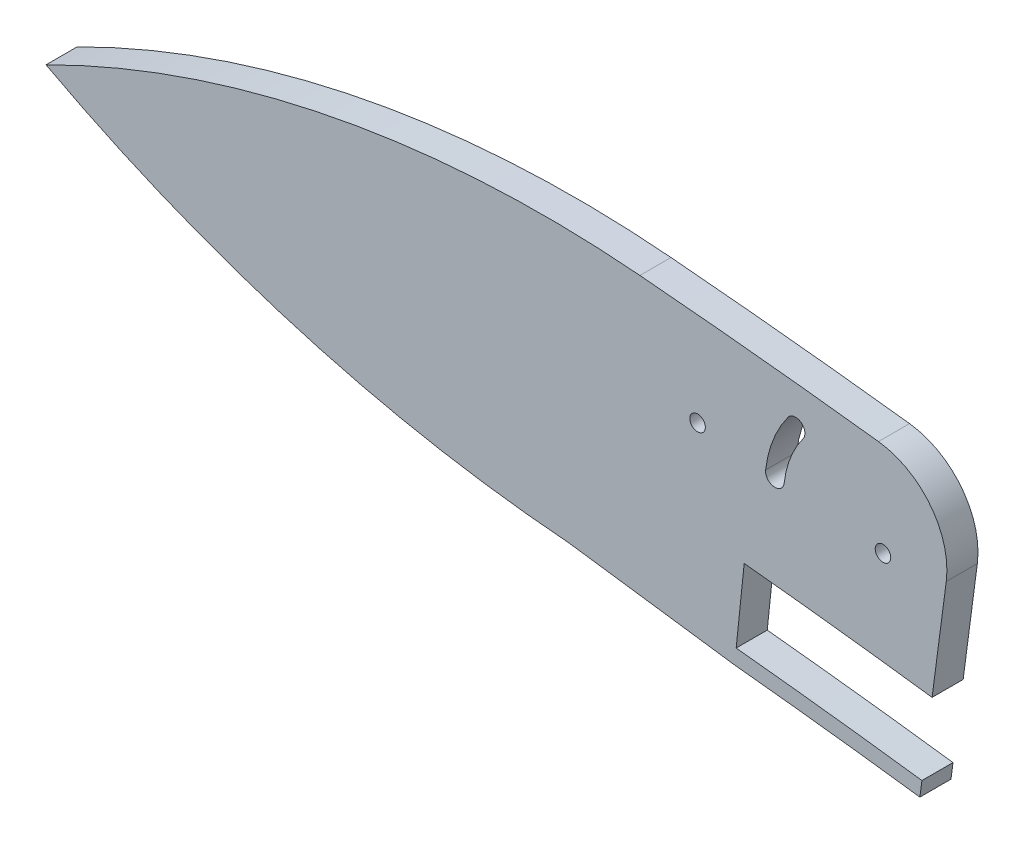
ISO-10303-21;
HEADER;
FILE_DESCRIPTION(('STEP AP214'),'2;1');
FILE_NAME('part.step','',(''),(''),'','','');
FILE_SCHEMA(('AUTOMOTIVE_DESIGN { 1 0 10303 214 1 1 1 1 }'));
ENDSEC;
DATA;
#1=APPLICATION_CONTEXT('core data for automotive mechanical design processes');
#2=APPLICATION_PROTOCOL_DEFINITION('international standard','automotive_design',2000,#1);
#3=PRODUCT_CONTEXT('',#1,'mechanical');
#4=PRODUCT('Part','Part','',(#3));
#5=PRODUCT_RELATED_PRODUCT_CATEGORY('part','',(#4));
#6=PRODUCT_DEFINITION_FORMATION('','',#4);
#7=PRODUCT_DEFINITION_CONTEXT('part definition',#1,'design');
#8=PRODUCT_DEFINITION('design','',#6,#7);
#9=PRODUCT_DEFINITION_SHAPE('','',#8);
#10=(LENGTH_UNIT() NAMED_UNIT(*) SI_UNIT(.MILLI.,.METRE.));
#11=(NAMED_UNIT(*) PLANE_ANGLE_UNIT() SI_UNIT($,.RADIAN.));
#12=(NAMED_UNIT(*) SI_UNIT($,.STERADIAN.) SOLID_ANGLE_UNIT());
#13=UNCERTAINTY_MEASURE_WITH_UNIT(LENGTH_MEASURE(1.E-05),#10,'distance_accuracy_value','');
#14=(GEOMETRIC_REPRESENTATION_CONTEXT(3) GLOBAL_UNCERTAINTY_ASSIGNED_CONTEXT((#13)) GLOBAL_UNIT_ASSIGNED_CONTEXT((#10,
#11,#12)) REPRESENTATION_CONTEXT('',''));
#15=CARTESIAN_POINT('',(0.,0.,0.));
#16=DIRECTION('',(0.,0.,1.));
#17=DIRECTION('',(1.,0.,0.));
#18=AXIS2_PLACEMENT_3D('',#15,#16,#17);
#19=CARTESIAN_POINT('',(44.3466964011451,-21.7902143594746,80.8310881524568));
#20=DIRECTION('',(0.99468010601748,-0.103012070618224,0.));
#21=DIRECTION('',(0.103012070618224,0.99468010601748,0.));
#22=AXIS2_PLACEMENT_3D('',#19,#20,#21);
#23=PLANE('',#22);
#24=DIRECTION('',(-0.103012070618224,-0.99468010601748,0.));
#25=VECTOR('',#24,1.);
#26=CARTESIAN_POINT('',(53.1498164751484,63.2123329725379,1.));
#27=LINE('',#26,#25);
#28=CARTESIAN_POINT('',(44.9132627895453,-16.3194737763785,1.));
#29=VERTEX_POINT('',#28);
#30=CARTESIAN_POINT('',(44.3982024364542,-21.2928743064659,1.));
#31=VERTEX_POINT('',#30);
#32=EDGE_CURVE('E191',#29,#31,#27,.T.);
#33=ORIENTED_EDGE('',*,*,#32,.T.);
#34=DIRECTION('',(0.,0.,-1.));
#35=VECTOR('',#34,1.);
#36=CARTESIAN_POINT('',(44.3982024364542,-21.2928743064659,23.9161159949144));
#37=LINE('',#36,#35);
#38=CARTESIAN_POINT('',(44.3982024364542,-21.2928743064659,-1.));
#39=VERTEX_POINT('',#38);
#40=EDGE_CURVE('E169',#31,#39,#37,.T.);
#41=ORIENTED_EDGE('',*,*,#40,.T.);
#42=DIRECTION('',(-0.103012070618224,-0.99468010601748,0.));
#43=VECTOR('',#42,1.);
#44=CARTESIAN_POINT('',(53.1498164751484,63.2123329725379,-1.));
#45=LINE('',#44,#43);
#46=CARTESIAN_POINT('',(44.9132627895453,-16.3194737763785,-1.));
#47=VERTEX_POINT('',#46);
#48=EDGE_CURVE('E265',#47,#39,#45,.T.);
#49=ORIENTED_EDGE('',*,*,#48,.F.);
#50=DIRECTION('',(0.,0.,-1.));
#51=VECTOR('',#50,1.);
#52=CARTESIAN_POINT('',(44.9132627895453,-16.3194737763785,80.8310881524568));
#53=LINE('',#52,#51);
#54=EDGE_CURVE('E187',#29,#47,#53,.T.);
#55=ORIENTED_EDGE('',*,*,#54,.F.);
#56=EDGE_LOOP('',(#33,#41,#49,#55));
#57=FACE_BOUND('',#56,.T.);
#58=ADVANCED_FACE('F33',(#57),#23,.T.);
#59=CARTESIAN_POINT('',(58.5688837980851,-5.84497543014734,1.));
#60=DIRECTION('',(-0.991417465557707,0.130734115620726,0.));
#61=DIRECTION('',(-0.130734115620726,-0.991417465557707,0.));
#62=AXIS2_PLACEMENT_3D('',#59,#60,#61);
#63=PLANE('',#62);
#64=DIRECTION('',(0.130734115620726,0.991417465557707,0.));
#65=VECTOR('',#64,1.);
#66=CARTESIAN_POINT('',(58.5688837980851,-5.84497543014734,-1.));
#67=LINE('',#66,#65);
#68=CARTESIAN_POINT('',(57.0000744106364,-17.7419850168398,-1.));
#69=VERTEX_POINT('',#68);
#70=CARTESIAN_POINT('',(57.9115242166121,-10.8300381823583,-1.));
#71=VERTEX_POINT('',#70);
#72=EDGE_CURVE('E251',#69,#71,#67,.T.);
#73=ORIENTED_EDGE('',*,*,#72,.T.);
#74=DIRECTION('',(0.,0.,-1.));
#75=VECTOR('',#74,1.);
#76=CARTESIAN_POINT('',(57.9115242166121,-10.8300381823583,1.));
#77=LINE('',#76,#75);
#78=CARTESIAN_POINT('',(57.9115242166121,-10.8300381823583,1.));
#79=VERTEX_POINT('',#78);
#80=EDGE_CURVE('E41',#71,#79,#77,.F.);
#81=ORIENTED_EDGE('',*,*,#80,.T.);
#82=DIRECTION('',(0.130734115620726,0.991417465557707,0.));
#83=VECTOR('',#82,1.);
#84=CARTESIAN_POINT('',(58.5688837980851,-5.84497543014734,1.));
#85=LINE('',#84,#83);
#86=CARTESIAN_POINT('',(57.0000744106364,-17.7419850168398,1.));
#87=VERTEX_POINT('',#86);
#88=EDGE_CURVE('E242',#87,#79,#85,.T.);
#89=ORIENTED_EDGE('',*,*,#88,.F.);
#90=DIRECTION('',(0.,0.,-1.));
#91=VECTOR('',#90,1.);
#92=CARTESIAN_POINT('',(57.0000744106364,-17.7419850168398,80.8310881524568));
#93=LINE('',#92,#91);
#94=EDGE_CURVE('E179',#87,#69,#93,.T.);
#95=ORIENTED_EDGE('',*,*,#94,.T.);
#96=EDGE_LOOP('',(#73,#81,#89,#95));
#97=FACE_BOUND('',#96,.T.);
#98=ADVANCED_FACE('F295',(#97),#63,.F.);
#99=CARTESIAN_POINT('',(40.2962682858289,64.543485174902,1.));
#100=DIRECTION('',(0.,0.,-1.));
#101=DIRECTION('',(-1.,0.,0.));
#102=AXIS2_PLACEMENT_3D('',#99,#100,#101);
#103=PLANE('',#102);
#104=CARTESIAN_POINT('',(41.9135289159148,-9.9917545161059,1.));
#105=DIRECTION('',(0.,0.,1.));
#106=DIRECTION('',(1.,0.,0.));
#107=AXIS2_PLACEMENT_3D('',#104,#105,#106);
#108=CIRCLE('',#107,0.499999999999999);
#109=CARTESIAN_POINT('',(42.4135289159148,-9.9917545161059,1.));
#110=VERTEX_POINT('',#109);
#111=EDGE_CURVE('E230',#110,#110,#108,.T.);
#112=ORIENTED_EDGE('',*,*,#111,.F.);
#113=EDGE_LOOP('',(#112));
#114=FACE_BOUND('',#113,.T.);
#115=CARTESIAN_POINT('',(53.8429065054605,-11.2917354105985,1.));
#116=DIRECTION('',(0.,0.,1.));
#117=DIRECTION('',(1.,0.,0.));
#118=AXIS2_PLACEMENT_3D('',#115,#116,#117);
#119=CIRCLE('',#118,0.499999999999999);
#120=CARTESIAN_POINT('',(54.3429065054605,-11.2917354105985,1.));
#121=VERTEX_POINT('',#120);
#122=EDGE_CURVE('E220',#121,#121,#119,.T.);
#123=ORIENTED_EDGE('',*,*,#122,.F.);
#124=EDGE_LOOP('',(#123));
#125=FACE_BOUND('',#124,.T.);
#126=CARTESIAN_POINT('',(53.8429065054605,-11.2917354105985,1.));
#127=DIRECTION('',(0.,0.,1.));
#128=DIRECTION('',(1.,0.,0.));
#129=AXIS2_PLACEMENT_3D('',#126,#127,#128);
#130=CIRCLE('',#129,7.59999999999999);
#131=CARTESIAN_POINT('',(47.7370083036234,-6.76647219739177,1.));
#132=VERTEX_POINT('',#131);
#133=CARTESIAN_POINT('',(46.2924119431444,-10.4256916100689,1.));
#134=VERTEX_POINT('',#133);
#135=EDGE_CURVE('E210',#132,#134,#130,.T.);
#136=ORIENTED_EDGE('',*,*,#135,.F.);
#137=CARTESIAN_POINT('',(48.2190528985052,-7.12372981948705,1.));
#138=DIRECTION('',(0.,0.,1.));
#139=DIRECTION('',(1.,0.,0.));
#140=AXIS2_PLACEMENT_3D('',#137,#138,#139);
#141=CIRCLE('',#140,0.599999999999996);
#142=CARTESIAN_POINT('',(48.7010974933871,-7.48098744158233,1.));
#143=VERTEX_POINT('',#142);
#144=EDGE_CURVE('E194',#143,#132,#141,.T.);
#145=ORIENTED_EDGE('',*,*,#144,.F.);
#146=CARTESIAN_POINT('',(53.8429065054605,-11.2917354105985,1.));
#147=DIRECTION('',(0.,0.,-1.));
#148=DIRECTION('',(1.,0.,0.));
#149=AXIS2_PLACEMENT_3D('',#146,#147,#148);
#150=CIRCLE('',#149,6.39999999999999);
#151=CARTESIAN_POINT('',(47.4845952950891,-10.5624353680472,1.));
#152=VERTEX_POINT('',#151);
#153=EDGE_CURVE('E199',#152,#143,#150,.T.);
#154=ORIENTED_EDGE('',*,*,#153,.F.);
#155=CARTESIAN_POINT('',(46.8885036191167,-10.4940634890581,1.));
#156=DIRECTION('',(0.,0.,1.));
#157=DIRECTION('',(1.,0.,0.));
#158=AXIS2_PLACEMENT_3D('',#155,#156,#157);
#159=CIRCLE('',#158,0.600000000000001);
#160=EDGE_CURVE('E213',#134,#152,#159,.T.);
#161=ORIENTED_EDGE('',*,*,#160,.F.);
#162=EDGE_LOOP('',(#136,#145,#154,#161));
#163=FACE_BOUND('',#162,.T.);
#164=ORIENTED_EDGE('',*,*,#88,.T.);
#165=CARTESIAN_POINT('',(52.9544368888235,-10.1763676042547,1.));
#166=DIRECTION('',(0.,0.,-1.));
#167=DIRECTION('',(-1.,0.,0.));
#168=AXIS2_PLACEMENT_3D('',#165,#166,#167);
#169=CIRCLE('',#168,5.);
#170=CARTESIAN_POINT('',(53.5521167634152,-5.21221825441565,1.));
#171=VERTEX_POINT('',#170);
#172=EDGE_CURVE('E11',#79,#171,#169,.F.);
#173=ORIENTED_EDGE('',*,*,#172,.T.);
#174=CARTESIAN_POINT('',(0.,-450.,1.));
#175=DIRECTION('',(0.,0.,1.));
#176=DIRECTION('',(1.,0.,0.));
#177=AXIS2_PLACEMENT_3D('',#174,#175,#176);
#178=CIRCLE('',#177,448.);
#179=CARTESIAN_POINT('',(38.2051521766566,-3.63202808987456,1.));
#180=VERTEX_POINT('',#179);
#181=EDGE_CURVE('E245',#171,#180,#178,.T.);
#182=ORIENTED_EDGE('',*,*,#181,.T.);
#183=CARTESIAN_POINT('',(32.1148023292848,-74.7883238958534,1.));
#184=DIRECTION('',(0.,0.,1.));
#185=DIRECTION('',(-1.,0.,0.));
#186=AXIS2_PLACEMENT_3D('',#183,#184,#185);
#187=CIRCLE('',#186,71.4164602461599);
#188=CARTESIAN_POINT('',(0.,-11.,1.));
#189=VERTEX_POINT('',#188);
#190=EDGE_CURVE('E247',#180,#189,#187,.T.);
#191=ORIENTED_EDGE('',*,*,#190,.T.);
#192=CARTESIAN_POINT('',(40.2962682858289,64.543485174902,1.));
#193=DIRECTION('',(0.,0.,1.));
#194=DIRECTION('',(-1.,0.,0.));
#195=AXIS2_PLACEMENT_3D('',#192,#193,#194);
#196=CIRCLE('',#195,85.6189662991451);
#197=CARTESIAN_POINT('',(33.611521044152,-20.8141245880771,1.));
#198=VERTEX_POINT('',#197);
#199=EDGE_CURVE('E239',#189,#198,#196,.T.);
#200=ORIENTED_EDGE('',*,*,#199,.T.);
#201=DIRECTION('',(-0.990623384922487,0.136621042466799,0.));
#202=VECTOR('',#201,1.);
#203=CARTESIAN_POINT('',(33.611521044152,-20.8141245880771,1.));
#204=LINE('',#203,#202);
#205=CARTESIAN_POINT('',(44.295190365836,-22.2875544124834,1.));
#206=VERTEX_POINT('',#205);
#207=EDGE_CURVE('E177',#206,#198,#204,.T.);
#208=ORIENTED_EDGE('',*,*,#207,.F.);
#209=CARTESIAN_POINT('',(0.,-450.,1.));
#210=DIRECTION('',(0.,0.,-1.));
#211=DIRECTION('',(-1.,0.,0.));
#212=AXIS2_PLACEMENT_3D('',#209,#210,#211);
#213=CIRCLE('',#212,430.);
#214=CARTESIAN_POINT('',(56.2156697169121,-23.690489810186,1.));
#215=VERTEX_POINT('',#214);
#216=EDGE_CURVE('E146',#215,#206,#213,.F.);
#217=ORIENTED_EDGE('',*,*,#216,.F.);
#218=DIRECTION('',(-0.130734115620715,-0.991417465557708,0.));
#219=VECTOR('',#218,1.);
#220=CARTESIAN_POINT('',(56.3464038325328,-22.6990723446283,1.));
#221=LINE('',#220,#219);
#222=CARTESIAN_POINT('',(56.3464038325328,-22.6990723446283,1.));
#223=VERTEX_POINT('',#222);
#224=EDGE_CURVE('E173',#223,#215,#221,.T.);
#225=ORIENTED_EDGE('',*,*,#224,.F.);
#226=CARTESIAN_POINT('',(0.,-450.,1.));
#227=DIRECTION('',(0.,0.,-1.));
#228=DIRECTION('',(-1.,0.,0.));
#229=AXIS2_PLACEMENT_3D('',#226,#227,#228);
#230=CIRCLE('',#229,431.);
#231=EDGE_CURVE('E149',#31,#223,#230,.T.);
#232=ORIENTED_EDGE('',*,*,#231,.F.);
#233=ORIENTED_EDGE('',*,*,#32,.F.);
#234=CARTESIAN_POINT('',(0.,-450.,1.));
#235=DIRECTION('',(0.,0.,-1.));
#236=DIRECTION('',(-1.,0.,0.));
#237=AXIS2_PLACEMENT_3D('',#234,#235,#236);
#238=CIRCLE('',#237,436.);
#239=EDGE_CURVE('E189',#87,#29,#238,.F.);
#240=ORIENTED_EDGE('',*,*,#239,.F.);
#241=EDGE_LOOP('',(#164,#173,#182,#191,#200,#208,#217,#225,#232,#233,#240));
#242=FACE_BOUND('',#241,.T.);
#243=ADVANCED_FACE('F287',(#114,#125,#163,#242),#103,.F.);
#244=CARTESIAN_POINT('',(40.2962682858289,64.543485174902,-1.));
#245=DIRECTION('',(0.,0.,-1.));
#246=DIRECTION('',(-1.,0.,0.));
#247=AXIS2_PLACEMENT_3D('',#244,#245,#246);
#248=PLANE('',#247);
#249=CARTESIAN_POINT('',(41.9135289159148,-9.9917545161059,-1.));
#250=DIRECTION('',(0.,0.,1.));
#251=DIRECTION('',(1.,0.,0.));
#252=AXIS2_PLACEMENT_3D('',#249,#250,#251);
#253=CIRCLE('',#252,0.499999999999999);
#254=CARTESIAN_POINT('',(42.4135289159148,-9.9917545161059,-1.));
#255=VERTEX_POINT('',#254);
#256=EDGE_CURVE('E233',#255,#255,#253,.T.);
#257=ORIENTED_EDGE('',*,*,#256,.T.);
#258=EDGE_LOOP('',(#257));
#259=FACE_BOUND('',#258,.T.);
#260=CARTESIAN_POINT('',(53.8429065054605,-11.2917354105985,-1.));
#261=DIRECTION('',(0.,0.,1.));
#262=DIRECTION('',(1.,0.,0.));
#263=AXIS2_PLACEMENT_3D('',#260,#261,#262);
#264=CIRCLE('',#263,0.499999999999999);
#265=CARTESIAN_POINT('',(54.3429065054605,-11.2917354105985,-1.));
#266=VERTEX_POINT('',#265);
#267=EDGE_CURVE('E227',#266,#266,#264,.T.);
#268=ORIENTED_EDGE('',*,*,#267,.T.);
#269=EDGE_LOOP('',(#268));
#270=FACE_BOUND('',#269,.T.);
#271=CARTESIAN_POINT('',(48.2190528985052,-7.12372981948705,-1.));
#272=DIRECTION('',(0.,0.,1.));
#273=DIRECTION('',(1.,0.,0.));
#274=AXIS2_PLACEMENT_3D('',#271,#272,#273);
#275=CIRCLE('',#274,0.599999999999996);
#276=CARTESIAN_POINT('',(48.7010974933871,-7.48098744158233,-1.));
#277=VERTEX_POINT('',#276);
#278=CARTESIAN_POINT('',(47.7370083036234,-6.76647219739177,-1.));
#279=VERTEX_POINT('',#278);
#280=EDGE_CURVE('E195',#277,#279,#275,.T.);
#281=ORIENTED_EDGE('',*,*,#280,.T.);
#282=CARTESIAN_POINT('',(53.8429065054605,-11.2917354105985,-1.));
#283=DIRECTION('',(0.,0.,1.));
#284=DIRECTION('',(1.,0.,0.));
#285=AXIS2_PLACEMENT_3D('',#282,#283,#284);
#286=CIRCLE('',#285,7.59999999999999);
#287=CARTESIAN_POINT('',(46.2924119431444,-10.4256916100689,-1.));
#288=VERTEX_POINT('',#287);
#289=EDGE_CURVE('E198',#279,#288,#286,.T.);
#290=ORIENTED_EDGE('',*,*,#289,.T.);
#291=CARTESIAN_POINT('',(46.8885036191167,-10.4940634890581,-1.));
#292=DIRECTION('',(0.,0.,1.));
#293=DIRECTION('',(1.,0.,0.));
#294=AXIS2_PLACEMENT_3D('',#291,#292,#293);
#295=CIRCLE('',#294,0.600000000000001);
#296=CARTESIAN_POINT('',(47.4845952950891,-10.5624353680472,-1.));
#297=VERTEX_POINT('',#296);
#298=EDGE_CURVE('E202',#288,#297,#295,.T.);
#299=ORIENTED_EDGE('',*,*,#298,.T.);
#300=CARTESIAN_POINT('',(53.8429065054605,-11.2917354105985,-1.));
#301=DIRECTION('',(0.,0.,-1.));
#302=DIRECTION('',(1.,0.,0.));
#303=AXIS2_PLACEMENT_3D('',#300,#301,#302);
#304=CIRCLE('',#303,6.39999999999999);
#305=EDGE_CURVE('E205',#297,#277,#304,.T.);
#306=ORIENTED_EDGE('',*,*,#305,.T.);
#307=EDGE_LOOP('',(#281,#290,#299,#306));
#308=FACE_BOUND('',#307,.T.);
#309=CARTESIAN_POINT('',(0.,-450.,-1.));
#310=DIRECTION('',(0.,0.,1.));
#311=DIRECTION('',(1.,0.,0.));
#312=AXIS2_PLACEMENT_3D('',#309,#310,#311);
#313=CIRCLE('',#312,448.);
#314=CARTESIAN_POINT('',(53.5521167634152,-5.21221825441565,-1.));
#315=VERTEX_POINT('',#314);
#316=CARTESIAN_POINT('',(38.2051521766566,-3.63202808987456,-1.));
#317=VERTEX_POINT('',#316);
#318=EDGE_CURVE('E253',#315,#317,#313,.T.);
#319=ORIENTED_EDGE('',*,*,#318,.F.);
#320=CARTESIAN_POINT('',(52.9544368888235,-10.1763676042547,-1.));
#321=DIRECTION('',(0.,0.,-1.));
#322=DIRECTION('',(-1.,0.,0.));
#323=AXIS2_PLACEMENT_3D('',#320,#321,#322);
#324=CIRCLE('',#323,5.);
#325=EDGE_CURVE('E55',#315,#71,#324,.T.);
#326=ORIENTED_EDGE('',*,*,#325,.T.);
#327=ORIENTED_EDGE('',*,*,#72,.F.);
#328=CARTESIAN_POINT('',(0.,-450.,-1.));
#329=DIRECTION('',(0.,0.,-1.));
#330=DIRECTION('',(-1.,0.,0.));
#331=AXIS2_PLACEMENT_3D('',#328,#329,#330);
#332=CIRCLE('',#331,436.);
#333=EDGE_CURVE('E262',#69,#47,#332,.F.);
#334=ORIENTED_EDGE('',*,*,#333,.T.);
#335=ORIENTED_EDGE('',*,*,#48,.T.);
#336=CARTESIAN_POINT('',(0.,-450.,-1.));
#337=DIRECTION('',(0.,0.,-1.));
#338=DIRECTION('',(-1.,0.,0.));
#339=AXIS2_PLACEMENT_3D('',#336,#337,#338);
#340=CIRCLE('',#339,431.);
#341=CARTESIAN_POINT('',(56.3464038325328,-22.6990723446283,-1.));
#342=VERTEX_POINT('',#341);
#343=EDGE_CURVE('E167',#342,#39,#340,.F.);
#344=ORIENTED_EDGE('',*,*,#343,.F.);
#345=DIRECTION('',(0.130734115620715,0.991417465557708,0.));
#346=VECTOR('',#345,1.);
#347=CARTESIAN_POINT('',(56.3464038325328,-22.6990723446283,-1.));
#348=LINE('',#347,#346);
#349=CARTESIAN_POINT('',(56.2156697169121,-23.690489810186,-1.));
#350=VERTEX_POINT('',#349);
#351=EDGE_CURVE('E160',#350,#342,#348,.T.);
#352=ORIENTED_EDGE('',*,*,#351,.F.);
#353=CARTESIAN_POINT('',(0.,-450.,-1.));
#354=DIRECTION('',(0.,0.,-1.));
#355=DIRECTION('',(-1.,0.,0.));
#356=AXIS2_PLACEMENT_3D('',#353,#354,#355);
#357=CIRCLE('',#356,430.);
#358=CARTESIAN_POINT('',(44.295190365836,-22.2875544124833,-1.));
#359=VERTEX_POINT('',#358);
#360=EDGE_CURVE('E145',#359,#350,#357,.T.);
#361=ORIENTED_EDGE('',*,*,#360,.F.);
#362=DIRECTION('',(0.990623384922487,-0.136621042466799,0.));
#363=VECTOR('',#362,1.);
#364=CARTESIAN_POINT('',(33.611521044152,-20.8141245880771,-1.));
#365=LINE('',#364,#363);
#366=CARTESIAN_POINT('',(33.611521044152,-20.8141245880771,-1.));
#367=VERTEX_POINT('',#366);
#368=EDGE_CURVE('E156',#367,#359,#365,.T.);
#369=ORIENTED_EDGE('',*,*,#368,.F.);
#370=CARTESIAN_POINT('',(40.2962682858289,64.543485174902,-1.));
#371=DIRECTION('',(0.,0.,1.));
#372=DIRECTION('',(-1.,0.,0.));
#373=AXIS2_PLACEMENT_3D('',#370,#371,#372);
#374=CIRCLE('',#373,85.6189662991451);
#375=CARTESIAN_POINT('',(0.,-11.,-1.));
#376=VERTEX_POINT('',#375);
#377=EDGE_CURVE('E236',#376,#367,#374,.T.);
#378=ORIENTED_EDGE('',*,*,#377,.F.);
#379=CARTESIAN_POINT('',(32.1148023292848,-74.7883238958534,-1.));
#380=DIRECTION('',(0.,0.,1.));
#381=DIRECTION('',(-1.,0.,0.));
#382=AXIS2_PLACEMENT_3D('',#379,#380,#381);
#383=CIRCLE('',#382,71.4164602461599);
#384=EDGE_CURVE('E243',#317,#376,#383,.T.);
#385=ORIENTED_EDGE('',*,*,#384,.F.);
#386=EDGE_LOOP('',(#319,#326,#327,#334,#335,#344,#352,#361,#369,#378,#385));
#387=FACE_BOUND('',#386,.T.);
#388=ADVANCED_FACE('F154',(#259,#270,#308,#387),#248,.T.);
#389=CARTESIAN_POINT('',(40.2962682858289,64.543485174902,1.));
#390=DIRECTION('',(0.,0.,-1.));
#391=DIRECTION('',(-1.,0.,0.));
#392=AXIS2_PLACEMENT_3D('',#389,#390,#391);
#393=CYLINDRICAL_SURFACE('',#392,85.6189662991451);
#394=ORIENTED_EDGE('',*,*,#377,.T.);
#395=DIRECTION('',(0.,0.,-1.));
#396=VECTOR('',#395,1.);
#397=CARTESIAN_POINT('',(33.611521044152,-20.8141245880771,1.));
#398=LINE('',#397,#396);
#399=EDGE_CURVE('E164',#198,#367,#398,.T.);
#400=ORIENTED_EDGE('',*,*,#399,.F.);
#401=ORIENTED_EDGE('',*,*,#199,.F.);
#402=DIRECTION('',(0.,0.,-1.));
#403=VECTOR('',#402,1.);
#404=CARTESIAN_POINT('',(0.,-11.,1.));
#405=LINE('',#404,#403);
#406=EDGE_CURVE('E249',#189,#376,#405,.T.);
#407=ORIENTED_EDGE('',*,*,#406,.T.);
#408=EDGE_LOOP('',(#394,#400,#401,#407));
#409=FACE_BOUND('',#408,.T.);
#410=ADVANCED_FACE('F285',(#409),#393,.T.);
#411=CARTESIAN_POINT('',(0.,-450.,1.));
#412=DIRECTION('',(0.,0.,-1.));
#413=DIRECTION('',(-1.,0.,0.));
#414=AXIS2_PLACEMENT_3D('',#411,#412,#413);
#415=CYLINDRICAL_SURFACE('',#414,448.);
#416=ORIENTED_EDGE('',*,*,#181,.F.);
#417=DIRECTION('',(0.,0.,-1.));
#418=VECTOR('',#417,1.);
#419=CARTESIAN_POINT('',(53.5521167634152,-5.21221825441553,1.));
#420=LINE('',#419,#418);
#421=EDGE_CURVE('E268',#171,#315,#420,.T.);
#422=ORIENTED_EDGE('',*,*,#421,.T.);
#423=ORIENTED_EDGE('',*,*,#318,.T.);
#424=DIRECTION('',(0.,0.,-1.));
#425=VECTOR('',#424,1.);
#426=CARTESIAN_POINT('',(38.2051521766566,-3.63202808987456,1.));
#427=LINE('',#426,#425);
#428=EDGE_CURVE('E258',#180,#317,#427,.T.);
#429=ORIENTED_EDGE('',*,*,#428,.F.);
#430=EDGE_LOOP('',(#416,#422,#423,#429));
#431=FACE_BOUND('',#430,.T.);
#432=ADVANCED_FACE('F274',(#431),#415,.T.);
#433=CARTESIAN_POINT('',(32.1148023292848,-74.7883238958534,1.));
#434=DIRECTION('',(0.,0.,-1.));
#435=DIRECTION('',(-1.,0.,0.));
#436=AXIS2_PLACEMENT_3D('',#433,#434,#435);
#437=CYLINDRICAL_SURFACE('',#436,71.4164602461599);
#438=ORIENTED_EDGE('',*,*,#384,.T.);
#439=ORIENTED_EDGE('',*,*,#406,.F.);
#440=ORIENTED_EDGE('',*,*,#190,.F.);
#441=ORIENTED_EDGE('',*,*,#428,.T.);
#442=EDGE_LOOP('',(#438,#439,#440,#441));
#443=FACE_BOUND('',#442,.T.);
#444=ADVANCED_FACE('F281',(#443),#437,.T.);
#445=CARTESIAN_POINT('',(41.9135289159148,-9.9917545161059,-1.));
#446=DIRECTION('',(0.,0.,1.));
#447=DIRECTION('',(1.,0.,0.));
#448=AXIS2_PLACEMENT_3D('',#445,#446,#447);
#449=CYLINDRICAL_SURFACE('',#448,0.499999999999999);
#450=ORIENTED_EDGE('',*,*,#256,.F.);
#451=EDGE_LOOP('',(#450));
#452=FACE_BOUND('',#451,.T.);
#453=ORIENTED_EDGE('',*,*,#111,.T.);
#454=EDGE_LOOP('',(#453));
#455=FACE_BOUND('',#454,.T.);
#456=ADVANCED_FACE('F324',(#452,#455),#449,.F.);
#457=CARTESIAN_POINT('',(53.8429065054605,-11.2917354105985,-1.));
#458=DIRECTION('',(0.,0.,1.));
#459=DIRECTION('',(1.,0.,0.));
#460=AXIS2_PLACEMENT_3D('',#457,#458,#459);
#461=CYLINDRICAL_SURFACE('',#460,0.499999999999999);
#462=ORIENTED_EDGE('',*,*,#267,.F.);
#463=EDGE_LOOP('',(#462));
#464=FACE_BOUND('',#463,.T.);
#465=ORIENTED_EDGE('',*,*,#122,.T.);
#466=EDGE_LOOP('',(#465));
#467=FACE_BOUND('',#466,.T.);
#468=ADVANCED_FACE('F320',(#464,#467),#461,.F.);
#469=CARTESIAN_POINT('',(48.2190528985052,-7.12372981948705,-1.));
#470=DIRECTION('',(0.,0.,1.));
#471=DIRECTION('',(1.,0.,0.));
#472=AXIS2_PLACEMENT_3D('',#469,#470,#471);
#473=CYLINDRICAL_SURFACE('',#472,0.599999999999996);
#474=ORIENTED_EDGE('',*,*,#144,.T.);
#475=DIRECTION('',(0.,0.,1.));
#476=VECTOR('',#475,1.);
#477=CARTESIAN_POINT('',(47.7370083036234,-6.76647219739177,-1.));
#478=LINE('',#477,#476);
#479=EDGE_CURVE('E208',#279,#132,#478,.T.);
#480=ORIENTED_EDGE('',*,*,#479,.F.);
#481=ORIENTED_EDGE('',*,*,#280,.F.);
#482=DIRECTION('',(0.,0.,1.));
#483=VECTOR('',#482,1.);
#484=CARTESIAN_POINT('',(48.7010974933871,-7.48098744158233,-1.));
#485=LINE('',#484,#483);
#486=EDGE_CURVE('E218',#277,#143,#485,.T.);
#487=ORIENTED_EDGE('',*,*,#486,.T.);
#488=EDGE_LOOP('',(#474,#480,#481,#487));
#489=FACE_BOUND('',#488,.T.);
#490=ADVANCED_FACE('F309',(#489),#473,.F.);
#491=CARTESIAN_POINT('',(53.8429065054605,-11.2917354105985,-1.));
#492=DIRECTION('',(0.,0.,1.));
#493=DIRECTION('',(1.,0.,0.));
#494=AXIS2_PLACEMENT_3D('',#491,#492,#493);
#495=CYLINDRICAL_SURFACE('',#494,6.39999999999999);
#496=ORIENTED_EDGE('',*,*,#153,.T.);
#497=ORIENTED_EDGE('',*,*,#486,.F.);
#498=ORIENTED_EDGE('',*,*,#305,.F.);
#499=DIRECTION('',(0.,0.,1.));
#500=VECTOR('',#499,1.);
#501=CARTESIAN_POINT('',(47.4845952950891,-10.5624353680472,-1.));
#502=LINE('',#501,#500);
#503=EDGE_CURVE('E221',#297,#152,#502,.T.);
#504=ORIENTED_EDGE('',*,*,#503,.T.);
#505=EDGE_LOOP('',(#496,#497,#498,#504));
#506=FACE_BOUND('',#505,.T.);
#507=ADVANCED_FACE('F305',(#506),#495,.T.);
#508=CARTESIAN_POINT('',(46.8885036191167,-10.4940634890581,-1.));
#509=DIRECTION('',(0.,0.,1.));
#510=DIRECTION('',(1.,0.,0.));
#511=AXIS2_PLACEMENT_3D('',#508,#509,#510);
#512=CYLINDRICAL_SURFACE('',#511,0.600000000000001);
#513=ORIENTED_EDGE('',*,*,#160,.T.);
#514=ORIENTED_EDGE('',*,*,#503,.F.);
#515=ORIENTED_EDGE('',*,*,#298,.F.);
#516=DIRECTION('',(0.,0.,1.));
#517=VECTOR('',#516,1.);
#518=CARTESIAN_POINT('',(46.2924119431444,-10.4256916100689,-1.));
#519=LINE('',#518,#517);
#520=EDGE_CURVE('E223',#288,#134,#519,.T.);
#521=ORIENTED_EDGE('',*,*,#520,.T.);
#522=EDGE_LOOP('',(#513,#514,#515,#521));
#523=FACE_BOUND('',#522,.T.);
#524=ADVANCED_FACE('F308',(#523),#512,.F.);
#525=CARTESIAN_POINT('',(53.8429065054605,-11.2917354105985,-1.));
#526=DIRECTION('',(0.,0.,1.));
#527=DIRECTION('',(1.,0.,0.));
#528=AXIS2_PLACEMENT_3D('',#525,#526,#527);
#529=CYLINDRICAL_SURFACE('',#528,7.59999999999999);
#530=ORIENTED_EDGE('',*,*,#135,.T.);
#531=ORIENTED_EDGE('',*,*,#520,.F.);
#532=ORIENTED_EDGE('',*,*,#289,.F.);
#533=ORIENTED_EDGE('',*,*,#479,.T.);
#534=EDGE_LOOP('',(#530,#531,#532,#533));
#535=FACE_BOUND('',#534,.T.);
#536=ADVANCED_FACE('F313',(#535),#529,.F.);
#537=CARTESIAN_POINT('',(0.,-450.,80.8310881524568));
#538=DIRECTION('',(0.,0.,-1.));
#539=DIRECTION('',(-1.,0.,0.));
#540=AXIS2_PLACEMENT_3D('',#537,#538,#539);
#541=CYLINDRICAL_SURFACE('',#540,436.);
#542=ORIENTED_EDGE('',*,*,#94,.F.);
#543=ORIENTED_EDGE('',*,*,#239,.T.);
#544=ORIENTED_EDGE('',*,*,#54,.T.);
#545=ORIENTED_EDGE('',*,*,#333,.F.);
#546=EDGE_LOOP('',(#542,#543,#544,#545));
#547=FACE_BOUND('',#546,.T.);
#548=ADVANCED_FACE('F304',(#547),#541,.F.);
#549=CARTESIAN_POINT('',(0.,-450.,23.9161159949144));
#550=DIRECTION('',(0.,0.,-1.));
#551=DIRECTION('',(-1.,0.,0.));
#552=AXIS2_PLACEMENT_3D('',#549,#550,#551);
#553=CYLINDRICAL_SURFACE('',#552,431.);
#554=ORIENTED_EDGE('',*,*,#40,.F.);
#555=ORIENTED_EDGE('',*,*,#231,.T.);
#556=DIRECTION('',(0.,0.,-1.));
#557=VECTOR('',#556,1.);
#558=CARTESIAN_POINT('',(56.3464038325328,-22.6990723446283,23.9161159949144));
#559=LINE('',#558,#557);
#560=EDGE_CURVE('E182',#223,#342,#559,.T.);
#561=ORIENTED_EDGE('',*,*,#560,.T.);
#562=ORIENTED_EDGE('',*,*,#343,.T.);
#563=EDGE_LOOP('',(#554,#555,#561,#562));
#564=FACE_BOUND('',#563,.T.);
#565=ADVANCED_FACE('F382',(#564),#553,.T.);
#566=CARTESIAN_POINT('',(56.3464038325328,-22.6990723446283,23.9161159949144));
#567=DIRECTION('',(-0.991417465557708,0.130734115620715,0.));
#568=DIRECTION('',(-0.130734115620715,-0.991417465557708,0.));
#569=AXIS2_PLACEMENT_3D('',#566,#567,#568);
#570=PLANE('',#569);
#571=ORIENTED_EDGE('',*,*,#560,.F.);
#572=ORIENTED_EDGE('',*,*,#224,.T.);
#573=DIRECTION('',(0.,0.,-1.));
#574=VECTOR('',#573,1.);
#575=CARTESIAN_POINT('',(56.2156697169121,-23.690489810186,23.9161159949144));
#576=LINE('',#575,#574);
#577=EDGE_CURVE('E150',#215,#350,#576,.T.);
#578=ORIENTED_EDGE('',*,*,#577,.T.);
#579=ORIENTED_EDGE('',*,*,#351,.T.);
#580=EDGE_LOOP('',(#571,#572,#578,#579));
#581=FACE_BOUND('',#580,.T.);
#582=ADVANCED_FACE('F388',(#581),#570,.F.);
#583=CARTESIAN_POINT('',(0.,-450.,23.9161159949144));
#584=DIRECTION('',(0.,0.,-1.));
#585=DIRECTION('',(-1.,0.,0.));
#586=AXIS2_PLACEMENT_3D('',#583,#584,#585);
#587=CYLINDRICAL_SURFACE('',#586,430.);
#588=ORIENTED_EDGE('',*,*,#577,.F.);
#589=ORIENTED_EDGE('',*,*,#216,.T.);
#590=DIRECTION('',(0.,0.,-1.));
#591=VECTOR('',#590,1.);
#592=CARTESIAN_POINT('',(44.295190365836,-22.2875544124833,23.9161159949144));
#593=LINE('',#592,#591);
#594=EDGE_CURVE('E141',#206,#359,#593,.T.);
#595=ORIENTED_EDGE('',*,*,#594,.T.);
#596=ORIENTED_EDGE('',*,*,#360,.T.);
#597=EDGE_LOOP('',(#588,#589,#595,#596));
#598=FACE_BOUND('',#597,.T.);
#599=ADVANCED_FACE('F144',(#598),#587,.F.);
#600=CARTESIAN_POINT('',(33.611521044152,-20.8141245880771,23.9161159949144));
#601=DIRECTION('',(0.136621042466799,0.990623384922487,0.));
#602=DIRECTION('',(-0.990623384922487,0.136621042466799,0.));
#603=AXIS2_PLACEMENT_3D('',#600,#601,#602);
#604=PLANE('',#603);
#605=ORIENTED_EDGE('',*,*,#594,.F.);
#606=ORIENTED_EDGE('',*,*,#207,.T.);
#607=ORIENTED_EDGE('',*,*,#399,.T.);
#608=ORIENTED_EDGE('',*,*,#368,.T.);
#609=EDGE_LOOP('',(#605,#606,#607,#608));
#610=FACE_BOUND('',#609,.T.);
#611=ADVANCED_FACE('F162',(#610),#604,.F.);
#612=CARTESIAN_POINT('',(52.9544368888235,-10.1763676042547,1.));
#613=DIRECTION('',(0.,0.,-1.));
#614=DIRECTION('',(-1.,0.,0.));
#615=AXIS2_PLACEMENT_3D('',#612,#613,#614);
#616=CYLINDRICAL_SURFACE('',#615,5.);
#617=ORIENTED_EDGE('',*,*,#172,.F.);
#618=ORIENTED_EDGE('',*,*,#80,.F.);
#619=ORIENTED_EDGE('',*,*,#325,.F.);
#620=ORIENTED_EDGE('',*,*,#421,.F.);
#621=EDGE_LOOP('',(#617,#618,#619,#620));
#622=FACE_BOUND('',#621,.T.);
#623=ADVANCED_FACE('F35',(#622),#616,.T.);
#624=CLOSED_SHELL('',(#58,#98,#243,#388,#410,#432,#444,#456,#468,#490,#507,#524,#536,#548,#565,
#582,#599,#611,#623));
#625=MANIFOLD_SOLID_BREP('B2',#624);
#626=ADVANCED_BREP_SHAPE_REPRESENTATION('',(#18,#625),#14);
#627=SHAPE_DEFINITION_REPRESENTATION(#9,#626);
ENDSEC;
END-ISO-10303-21;
